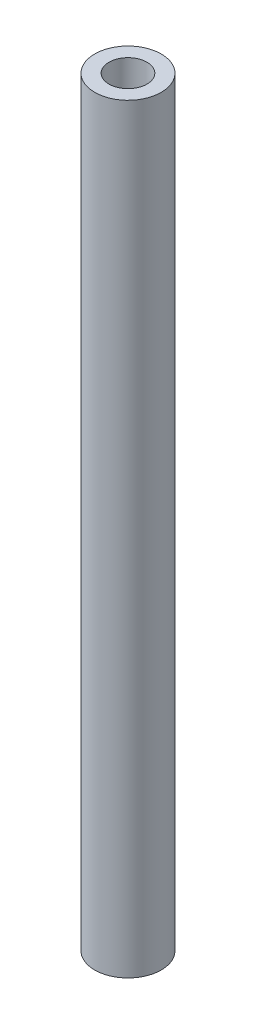
ISO-10303-21;
HEADER;
FILE_DESCRIPTION(('STEP AP214'),'2;1');
FILE_NAME('part.step','',(''),(''),'','','');
FILE_SCHEMA(('AUTOMOTIVE_DESIGN { 1 0 10303 214 1 1 1 1 }'));
ENDSEC;
DATA;
#1=APPLICATION_CONTEXT('core data for automotive mechanical design processes');
#2=APPLICATION_PROTOCOL_DEFINITION('international standard','automotive_design',2000,#1);
#3=PRODUCT_CONTEXT('',#1,'mechanical');
#4=PRODUCT('Part','Part','',(#3));
#5=PRODUCT_RELATED_PRODUCT_CATEGORY('part','',(#4));
#6=PRODUCT_DEFINITION_FORMATION('','',#4);
#7=PRODUCT_DEFINITION_CONTEXT('part definition',#1,'design');
#8=PRODUCT_DEFINITION('design','',#6,#7);
#9=PRODUCT_DEFINITION_SHAPE('','',#8);
#10=(LENGTH_UNIT() NAMED_UNIT(*) SI_UNIT(.MILLI.,.METRE.));
#11=(NAMED_UNIT(*) PLANE_ANGLE_UNIT() SI_UNIT($,.RADIAN.));
#12=(NAMED_UNIT(*) SI_UNIT($,.STERADIAN.) SOLID_ANGLE_UNIT());
#13=UNCERTAINTY_MEASURE_WITH_UNIT(LENGTH_MEASURE(1.E-05),#10,'distance_accuracy_value','');
#14=(GEOMETRIC_REPRESENTATION_CONTEXT(3) GLOBAL_UNCERTAINTY_ASSIGNED_CONTEXT((#13)) GLOBAL_UNIT_ASSIGNED_CONTEXT((#10,
#11,#12)) REPRESENTATION_CONTEXT('',''));
#15=CARTESIAN_POINT('',(0.,0.,0.));
#16=DIRECTION('',(0.,0.,1.));
#17=DIRECTION('',(1.,0.,0.));
#18=AXIS2_PLACEMENT_3D('',#15,#16,#17);
#19=CARTESIAN_POINT('',(0.,40.,0.));
#20=DIRECTION('',(0.,1.,0.));
#21=DIRECTION('',(0.,0.,1.));
#22=AXIS2_PLACEMENT_3D('',#19,#20,#21);
#23=PLANE('',#22);
#24=CARTESIAN_POINT('',(0.,40.,0.));
#25=DIRECTION('',(0.,1.,0.));
#26=DIRECTION('',(0.,0.,1.));
#27=AXIS2_PLACEMENT_3D('',#24,#25,#26);
#28=CIRCLE('',#27,1.75);
#29=CARTESIAN_POINT('',(0.,40.,1.75));
#30=VERTEX_POINT('',#29);
#31=EDGE_CURVE('E10',#30,#30,#28,.T.);
#32=ORIENTED_EDGE('',*,*,#31,.T.);
#33=EDGE_LOOP('',(#32));
#34=FACE_BOUND('',#33,.T.);
#35=CARTESIAN_POINT('',(0.,40.,0.));
#36=DIRECTION('',(0.,1.,0.));
#37=DIRECTION('',(0.,0.,1.));
#38=AXIS2_PLACEMENT_3D('',#35,#36,#37);
#39=CIRCLE('',#38,1.);
#40=CARTESIAN_POINT('',(0.,40.,1.));
#41=VERTEX_POINT('',#40);
#42=EDGE_CURVE('E56',#41,#41,#39,.T.);
#43=ORIENTED_EDGE('',*,*,#42,.F.);
#44=EDGE_LOOP('',(#43));
#45=FACE_BOUND('',#44,.T.);
#46=ADVANCED_FACE('F43',(#34,#45),#23,.T.);
#47=CARTESIAN_POINT('',(0.,0.,0.));
#48=DIRECTION('',(0.,1.,0.));
#49=DIRECTION('',(0.,0.,1.));
#50=AXIS2_PLACEMENT_3D('',#47,#48,#49);
#51=PLANE('',#50);
#52=CARTESIAN_POINT('',(0.,0.,0.));
#53=DIRECTION('',(0.,1.,0.));
#54=DIRECTION('',(0.,0.,1.));
#55=AXIS2_PLACEMENT_3D('',#52,#53,#54);
#56=CIRCLE('',#55,1.75);
#57=CARTESIAN_POINT('',(0.,0.,1.75));
#58=VERTEX_POINT('',#57);
#59=EDGE_CURVE('E47',#58,#58,#56,.T.);
#60=ORIENTED_EDGE('',*,*,#59,.F.);
#61=EDGE_LOOP('',(#60));
#62=FACE_BOUND('',#61,.T.);
#63=CARTESIAN_POINT('',(0.,0.,0.));
#64=DIRECTION('',(0.,1.,0.));
#65=DIRECTION('',(0.,0.,1.));
#66=AXIS2_PLACEMENT_3D('',#63,#64,#65);
#67=CIRCLE('',#66,1.);
#68=CARTESIAN_POINT('',(0.,0.,1.));
#69=VERTEX_POINT('',#68);
#70=EDGE_CURVE('E58',#69,#69,#67,.T.);
#71=ORIENTED_EDGE('',*,*,#70,.T.);
#72=EDGE_LOOP('',(#71));
#73=FACE_BOUND('',#72,.T.);
#74=ADVANCED_FACE('F70',(#62,#73),#51,.F.);
#75=CARTESIAN_POINT('',(0.,40.,0.));
#76=DIRECTION('',(0.,-1.,0.));
#77=DIRECTION('',(0.,0.,-1.));
#78=AXIS2_PLACEMENT_3D('',#75,#76,#77);
#79=CYLINDRICAL_SURFACE('',#78,1.75);
#80=ORIENTED_EDGE('',*,*,#31,.F.);
#81=EDGE_LOOP('',(#80));
#82=FACE_BOUND('',#81,.T.);
#83=ORIENTED_EDGE('',*,*,#59,.T.);
#84=EDGE_LOOP('',(#83));
#85=FACE_BOUND('',#84,.T.);
#86=ADVANCED_FACE('F45',(#82,#85),#79,.T.);
#87=CARTESIAN_POINT('',(0.,40.,0.));
#88=DIRECTION('',(0.,-1.,0.));
#89=DIRECTION('',(0.,0.,-1.));
#90=AXIS2_PLACEMENT_3D('',#87,#88,#89);
#91=CYLINDRICAL_SURFACE('',#90,1.);
#92=ORIENTED_EDGE('',*,*,#42,.T.);
#93=EDGE_LOOP('',(#92));
#94=FACE_BOUND('',#93,.T.);
#95=ORIENTED_EDGE('',*,*,#70,.F.);
#96=EDGE_LOOP('',(#95));
#97=FACE_BOUND('',#96,.T.);
#98=ADVANCED_FACE('F66',(#94,#97),#91,.F.);
#99=CLOSED_SHELL('',(#46,#74,#86,#98));
#100=MANIFOLD_SOLID_BREP('B2',#99);
#101=ADVANCED_BREP_SHAPE_REPRESENTATION('',(#18,#100),#14);
#102=SHAPE_DEFINITION_REPRESENTATION(#9,#101);
ENDSEC;
END-ISO-10303-21;
